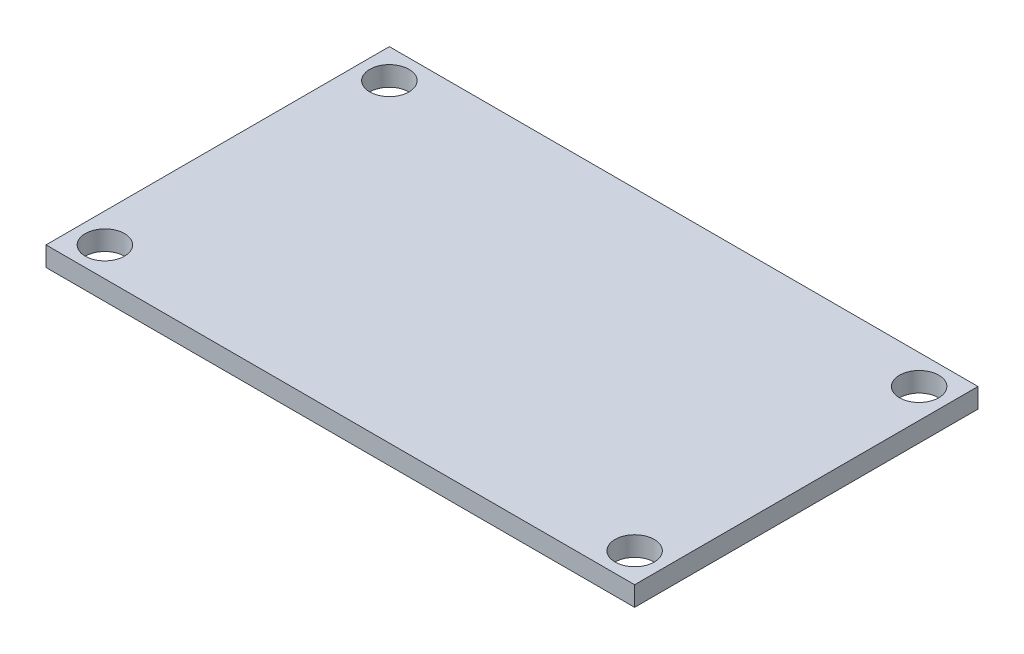
ISO-10303-21;
HEADER;
FILE_DESCRIPTION(('STEP AP214'),'2;1');
FILE_NAME('part.step','',(''),(''),'','','');
FILE_SCHEMA(('AUTOMOTIVE_DESIGN { 1 0 10303 214 1 1 1 1 }'));
ENDSEC;
DATA;
#1=APPLICATION_CONTEXT('core data for automotive mechanical design processes');
#2=APPLICATION_PROTOCOL_DEFINITION('international standard','automotive_design',2000,#1);
#3=PRODUCT_CONTEXT('',#1,'mechanical');
#4=PRODUCT('Part','Part','',(#3));
#5=PRODUCT_RELATED_PRODUCT_CATEGORY('part','',(#4));
#6=PRODUCT_DEFINITION_FORMATION('','',#4);
#7=PRODUCT_DEFINITION_CONTEXT('part definition',#1,'design');
#8=PRODUCT_DEFINITION('design','',#6,#7);
#9=PRODUCT_DEFINITION_SHAPE('','',#8);
#10=(LENGTH_UNIT() NAMED_UNIT(*) SI_UNIT(.MILLI.,.METRE.));
#11=(NAMED_UNIT(*) PLANE_ANGLE_UNIT() SI_UNIT($,.RADIAN.));
#12=(NAMED_UNIT(*) SI_UNIT($,.STERADIAN.) SOLID_ANGLE_UNIT());
#13=UNCERTAINTY_MEASURE_WITH_UNIT(LENGTH_MEASURE(1.E-05),#10,'distance_accuracy_value','');
#14=(GEOMETRIC_REPRESENTATION_CONTEXT(3) GLOBAL_UNCERTAINTY_ASSIGNED_CONTEXT((#13)) GLOBAL_UNIT_ASSIGNED_CONTEXT((#10,
#11,#12)) REPRESENTATION_CONTEXT('',''));
#15=CARTESIAN_POINT('',(0.,0.,0.));
#16=DIRECTION('',(0.,0.,1.));
#17=DIRECTION('',(1.,0.,0.));
#18=AXIS2_PLACEMENT_3D('',#15,#16,#17);
#19=CARTESIAN_POINT('',(0.,-0.399999999999993,-29.5808097472206));
#20=DIRECTION('',(0.,0.,1.));
#21=DIRECTION('',(0.,-1.,0.));
#22=AXIS2_PLACEMENT_3D('',#19,#20,#21);
#23=PLANE('',#22);
#24=DIRECTION('',(1.,0.,0.));
#25=VECTOR('',#24,1.);
#26=CARTESIAN_POINT('',(0.,1.60000000000001,-29.5808097472206));
#27=LINE('',#26,#25);
#28=CARTESIAN_POINT('',(-100.617927731979,1.60000000000001,-29.5808097472206));
#29=VERTEX_POINT('',#28);
#30=CARTESIAN_POINT('',(-40.6179277319788,1.60000000000001,-29.5808097472206));
#31=VERTEX_POINT('',#30);
#32=EDGE_CURVE('E114',#29,#31,#27,.T.);
#33=ORIENTED_EDGE('',*,*,#32,.F.);
#34=DIRECTION('',(0.,1.,0.));
#35=VECTOR('',#34,1.);
#36=CARTESIAN_POINT('',(-100.617927731979,-0.399999999999989,-29.5808097472206));
#37=LINE('',#36,#35);
#38=CARTESIAN_POINT('',(-100.617927731979,-0.399999999999989,-29.5808097472206));
#39=VERTEX_POINT('',#38);
#40=EDGE_CURVE('E11',#39,#29,#37,.T.);
#41=ORIENTED_EDGE('',*,*,#40,.F.);
#42=DIRECTION('',(1.,0.,0.));
#43=VECTOR('',#42,1.);
#44=CARTESIAN_POINT('',(0.,-0.399999999999993,-29.5808097472206));
#45=LINE('',#44,#43);
#46=CARTESIAN_POINT('',(-40.6179277319788,-0.399999999999992,-29.5808097472206));
#47=VERTEX_POINT('',#46);
#48=EDGE_CURVE('E96',#39,#47,#45,.T.);
#49=ORIENTED_EDGE('',*,*,#48,.T.);
#50=DIRECTION('',(0.,1.,0.));
#51=VECTOR('',#50,1.);
#52=CARTESIAN_POINT('',(-40.6179277319788,-0.399999999999992,-29.5808097472206));
#53=LINE('',#52,#51);
#54=EDGE_CURVE('E38',#47,#31,#53,.T.);
#55=ORIENTED_EDGE('',*,*,#54,.T.);
#56=EDGE_LOOP('',(#33,#41,#49,#55));
#57=FACE_BOUND('',#56,.T.);
#58=ADVANCED_FACE('F35',(#57),#23,.T.);
#59=CARTESIAN_POINT('',(-100.617927731979,-0.399999999999994,0.));
#60=DIRECTION('',(1.,0.,0.));
#61=DIRECTION('',(0.,1.,0.));
#62=AXIS2_PLACEMENT_3D('',#59,#60,#61);
#63=PLANE('',#62);
#64=DIRECTION('',(0.,0.,-1.));
#65=VECTOR('',#64,1.);
#66=CARTESIAN_POINT('',(-100.617927731979,1.60000000000001,0.));
#67=LINE('',#66,#65);
#68=CARTESIAN_POINT('',(-100.617927731979,1.60000000000002,-64.5808097472206));
#69=VERTEX_POINT('',#68);
#70=EDGE_CURVE('E68',#29,#69,#67,.T.);
#71=ORIENTED_EDGE('',*,*,#70,.T.);
#72=DIRECTION('',(0.,1.,0.));
#73=VECTOR('',#72,1.);
#74=CARTESIAN_POINT('',(-100.617927731979,-0.399999999999984,-64.5808097472206));
#75=LINE('',#74,#73);
#76=CARTESIAN_POINT('',(-100.617927731979,-0.399999999999984,-64.5808097472206));
#77=VERTEX_POINT('',#76);
#78=EDGE_CURVE('E44',#77,#69,#75,.T.);
#79=ORIENTED_EDGE('',*,*,#78,.F.);
#80=DIRECTION('',(0.,0.,-1.));
#81=VECTOR('',#80,1.);
#82=CARTESIAN_POINT('',(-100.617927731979,-0.399999999999994,0.));
#83=LINE('',#82,#81);
#84=EDGE_CURVE('E86',#39,#77,#83,.T.);
#85=ORIENTED_EDGE('',*,*,#84,.F.);
#86=ORIENTED_EDGE('',*,*,#40,.T.);
#87=EDGE_LOOP('',(#71,#79,#85,#86));
#88=FACE_BOUND('',#87,.T.);
#89=ADVANCED_FACE('F136',(#88),#63,.F.);
#90=CARTESIAN_POINT('',(0.,-0.399999999999988,-64.5808097472206));
#91=DIRECTION('',(0.,0.,1.));
#92=DIRECTION('',(0.,-1.,0.));
#93=AXIS2_PLACEMENT_3D('',#90,#91,#92);
#94=PLANE('',#93);
#95=DIRECTION('',(1.,0.,0.));
#96=VECTOR('',#95,1.);
#97=CARTESIAN_POINT('',(0.,1.60000000000001,-64.5808097472206));
#98=LINE('',#97,#96);
#99=CARTESIAN_POINT('',(-40.6179277319788,1.60000000000001,-64.5808097472206));
#100=VERTEX_POINT('',#99);
#101=EDGE_CURVE('E93',#69,#100,#98,.T.);
#102=ORIENTED_EDGE('',*,*,#101,.T.);
#103=DIRECTION('',(0.,1.,0.));
#104=VECTOR('',#103,1.);
#105=CARTESIAN_POINT('',(-40.6179277319788,-0.399999999999986,-64.5808097472206));
#106=LINE('',#105,#104);
#107=CARTESIAN_POINT('',(-40.6179277319788,-0.399999999999986,-64.5808097472206));
#108=VERTEX_POINT('',#107);
#109=EDGE_CURVE('E90',#108,#100,#106,.T.);
#110=ORIENTED_EDGE('',*,*,#109,.F.);
#111=DIRECTION('',(1.,0.,0.));
#112=VECTOR('',#111,1.);
#113=CARTESIAN_POINT('',(0.,-0.399999999999988,-64.5808097472206));
#114=LINE('',#113,#112);
#115=EDGE_CURVE('E80',#77,#108,#114,.T.);
#116=ORIENTED_EDGE('',*,*,#115,.F.);
#117=ORIENTED_EDGE('',*,*,#78,.T.);
#118=EDGE_LOOP('',(#102,#110,#116,#117));
#119=FACE_BOUND('',#118,.T.);
#120=ADVANCED_FACE('F91',(#119),#94,.F.);
#121=CARTESIAN_POINT('',(-97.6179277319788,-0.399999999999989,-32.5808097472206));
#122=DIRECTION('',(0.,1.,0.));
#123=DIRECTION('',(0.,0.,1.));
#124=AXIS2_PLACEMENT_3D('',#121,#122,#123);
#125=CYLINDRICAL_SURFACE('',#124,2.);
#126=CARTESIAN_POINT('',(-97.6179277319788,-0.399999999999989,-32.5808097472206));
#127=DIRECTION('',(0.,1.,0.));
#128=DIRECTION('',(0.,0.,1.));
#129=AXIS2_PLACEMENT_3D('',#126,#127,#128);
#130=CIRCLE('',#129,2.);
#131=CARTESIAN_POINT('',(-97.6179277319788,-0.399999999999989,-30.5808097472206));
#132=VERTEX_POINT('',#131);
#133=EDGE_CURVE('E108',#132,#132,#130,.T.);
#134=ORIENTED_EDGE('',*,*,#133,.F.);
#135=EDGE_LOOP('',(#134));
#136=FACE_BOUND('',#135,.T.);
#137=CARTESIAN_POINT('',(-97.6179277319788,1.60000000000001,-32.5808097472206));
#138=DIRECTION('',(0.,1.,0.));
#139=DIRECTION('',(0.,0.,1.));
#140=AXIS2_PLACEMENT_3D('',#137,#138,#139);
#141=CIRCLE('',#140,2.);
#142=CARTESIAN_POINT('',(-97.6179277319788,1.60000000000001,-30.5808097472206));
#143=VERTEX_POINT('',#142);
#144=EDGE_CURVE('E127',#143,#143,#141,.T.);
#145=ORIENTED_EDGE('',*,*,#144,.T.);
#146=EDGE_LOOP('',(#145));
#147=FACE_BOUND('',#146,.T.);
#148=ADVANCED_FACE('F144',(#136,#147),#125,.F.);
#149=CARTESIAN_POINT('',(-43.6179277319788,-0.399999999999987,-61.5808097472206));
#150=DIRECTION('',(0.,1.,0.));
#151=DIRECTION('',(0.,0.,1.));
#152=AXIS2_PLACEMENT_3D('',#149,#150,#151);
#153=CYLINDRICAL_SURFACE('',#152,2.);
#154=CARTESIAN_POINT('',(-43.6179277319788,-0.399999999999987,-61.5808097472206));
#155=DIRECTION('',(0.,1.,0.));
#156=DIRECTION('',(0.,0.,1.));
#157=AXIS2_PLACEMENT_3D('',#154,#155,#156);
#158=CIRCLE('',#157,2.);
#159=CARTESIAN_POINT('',(-43.6179277319788,-0.399999999999987,-59.5808097472206));
#160=VERTEX_POINT('',#159);
#161=EDGE_CURVE('E105',#160,#160,#158,.T.);
#162=ORIENTED_EDGE('',*,*,#161,.F.);
#163=EDGE_LOOP('',(#162));
#164=FACE_BOUND('',#163,.T.);
#165=CARTESIAN_POINT('',(-43.6179277319788,1.60000000000001,-61.5808097472206));
#166=DIRECTION('',(0.,1.,0.));
#167=DIRECTION('',(0.,0.,1.));
#168=AXIS2_PLACEMENT_3D('',#165,#166,#167);
#169=CIRCLE('',#168,2.);
#170=CARTESIAN_POINT('',(-43.6179277319788,1.60000000000001,-59.5808097472206));
#171=VERTEX_POINT('',#170);
#172=EDGE_CURVE('E124',#171,#171,#169,.T.);
#173=ORIENTED_EDGE('',*,*,#172,.T.);
#174=EDGE_LOOP('',(#173));
#175=FACE_BOUND('',#174,.T.);
#176=ADVANCED_FACE('F157',(#164,#175),#153,.F.);
#177=CARTESIAN_POINT('',(-43.6179277319788,-0.399999999999991,-32.5808097472206));
#178=DIRECTION('',(0.,1.,0.));
#179=DIRECTION('',(0.,0.,1.));
#180=AXIS2_PLACEMENT_3D('',#177,#178,#179);
#181=CYLINDRICAL_SURFACE('',#180,2.);
#182=CARTESIAN_POINT('',(-43.6179277319788,-0.399999999999991,-32.5808097472206));
#183=DIRECTION('',(0.,1.,0.));
#184=DIRECTION('',(0.,0.,1.));
#185=AXIS2_PLACEMENT_3D('',#182,#183,#184);
#186=CIRCLE('',#185,2.);
#187=CARTESIAN_POINT('',(-43.6179277319788,-0.399999999999992,-30.5808097472207));
#188=VERTEX_POINT('',#187);
#189=EDGE_CURVE('E102',#188,#188,#186,.F.);
#190=ORIENTED_EDGE('',*,*,#189,.T.);
#191=EDGE_LOOP('',(#190));
#192=FACE_BOUND('',#191,.T.);
#193=CARTESIAN_POINT('',(-43.6179277319788,1.60000000000001,-32.5808097472206));
#194=DIRECTION('',(0.,1.,0.));
#195=DIRECTION('',(0.,0.,1.));
#196=AXIS2_PLACEMENT_3D('',#193,#194,#195);
#197=CIRCLE('',#196,2.);
#198=CARTESIAN_POINT('',(-43.6179277319788,1.60000000000001,-30.5808097472207));
#199=VERTEX_POINT('',#198);
#200=EDGE_CURVE('E121',#199,#199,#197,.F.);
#201=ORIENTED_EDGE('',*,*,#200,.F.);
#202=EDGE_LOOP('',(#201));
#203=FACE_BOUND('',#202,.T.);
#204=ADVANCED_FACE('F147',(#192,#203),#181,.F.);
#205=CARTESIAN_POINT('',(-40.6179277319788,-0.399999999999996,0.));
#206=DIRECTION('',(1.,0.,0.));
#207=DIRECTION('',(0.,0.,-1.));
#208=AXIS2_PLACEMENT_3D('',#205,#206,#207);
#209=PLANE('',#208);
#210=DIRECTION('',(0.,0.,-1.));
#211=VECTOR('',#210,1.);
#212=CARTESIAN_POINT('',(-40.6179277319788,1.6,0.));
#213=LINE('',#212,#211);
#214=EDGE_CURVE('E117',#31,#100,#213,.T.);
#215=ORIENTED_EDGE('',*,*,#214,.F.);
#216=ORIENTED_EDGE('',*,*,#54,.F.);
#217=DIRECTION('',(0.,0.,-1.));
#218=VECTOR('',#217,1.);
#219=CARTESIAN_POINT('',(-40.6179277319788,-0.399999999999996,0.));
#220=LINE('',#219,#218);
#221=EDGE_CURVE('E85',#47,#108,#220,.T.);
#222=ORIENTED_EDGE('',*,*,#221,.T.);
#223=ORIENTED_EDGE('',*,*,#109,.T.);
#224=EDGE_LOOP('',(#215,#216,#222,#223));
#225=FACE_BOUND('',#224,.T.);
#226=ADVANCED_FACE('F95',(#225),#209,.T.);
#227=CARTESIAN_POINT('',(-97.6179277319788,-0.399999999999985,-61.5808097472206));
#228=DIRECTION('',(0.,1.,0.));
#229=DIRECTION('',(0.,0.,1.));
#230=AXIS2_PLACEMENT_3D('',#227,#228,#229);
#231=CYLINDRICAL_SURFACE('',#230,2.);
#232=CARTESIAN_POINT('',(-97.6179277319788,-0.399999999999985,-61.5808097472206));
#233=DIRECTION('',(0.,1.,0.));
#234=DIRECTION('',(0.,0.,1.));
#235=AXIS2_PLACEMENT_3D('',#232,#233,#234);
#236=CIRCLE('',#235,2.);
#237=CARTESIAN_POINT('',(-97.6179277319788,-0.399999999999985,-59.5808097472206));
#238=VERTEX_POINT('',#237);
#239=EDGE_CURVE('E111',#238,#238,#236,.F.);
#240=ORIENTED_EDGE('',*,*,#239,.T.);
#241=EDGE_LOOP('',(#240));
#242=FACE_BOUND('',#241,.T.);
#243=CARTESIAN_POINT('',(-97.6179277319788,1.60000000000002,-61.5808097472206));
#244=DIRECTION('',(0.,1.,0.));
#245=DIRECTION('',(0.,0.,1.));
#246=AXIS2_PLACEMENT_3D('',#243,#244,#245);
#247=CIRCLE('',#246,2.);
#248=CARTESIAN_POINT('',(-97.6179277319788,1.60000000000002,-59.5808097472206));
#249=VERTEX_POINT('',#248);
#250=EDGE_CURVE('E98',#249,#249,#247,.F.);
#251=ORIENTED_EDGE('',*,*,#250,.F.);
#252=EDGE_LOOP('',(#251));
#253=FACE_BOUND('',#252,.T.);
#254=ADVANCED_FACE('F150',(#242,#253),#231,.F.);
#255=CARTESIAN_POINT('',(0.,-0.399999999999998,0.));
#256=DIRECTION('',(0.,1.,0.));
#257=DIRECTION('',(0.,0.,1.));
#258=AXIS2_PLACEMENT_3D('',#255,#256,#257);
#259=PLANE('',#258);
#260=ORIENTED_EDGE('',*,*,#48,.F.);
#261=ORIENTED_EDGE('',*,*,#84,.T.);
#262=ORIENTED_EDGE('',*,*,#115,.T.);
#263=ORIENTED_EDGE('',*,*,#221,.F.);
#264=EDGE_LOOP('',(#260,#261,#262,#263));
#265=FACE_BOUND('',#264,.T.);
#266=ORIENTED_EDGE('',*,*,#189,.F.);
#267=EDGE_LOOP('',(#266));
#268=FACE_BOUND('',#267,.T.);
#269=ORIENTED_EDGE('',*,*,#161,.T.);
#270=EDGE_LOOP('',(#269));
#271=FACE_BOUND('',#270,.T.);
#272=ORIENTED_EDGE('',*,*,#133,.T.);
#273=EDGE_LOOP('',(#272));
#274=FACE_BOUND('',#273,.T.);
#275=ORIENTED_EDGE('',*,*,#239,.F.);
#276=EDGE_LOOP('',(#275));
#277=FACE_BOUND('',#276,.T.);
#278=ADVANCED_FACE('F83',(#265,#268,#271,#274,#277),#259,.F.);
#279=CARTESIAN_POINT('',(0.,1.6,0.));
#280=DIRECTION('',(0.,1.,0.));
#281=DIRECTION('',(0.,0.,1.));
#282=AXIS2_PLACEMENT_3D('',#279,#280,#281);
#283=PLANE('',#282);
#284=ORIENTED_EDGE('',*,*,#32,.T.);
#285=ORIENTED_EDGE('',*,*,#214,.T.);
#286=ORIENTED_EDGE('',*,*,#101,.F.);
#287=ORIENTED_EDGE('',*,*,#70,.F.);
#288=EDGE_LOOP('',(#284,#285,#286,#287));
#289=FACE_BOUND('',#288,.T.);
#290=ORIENTED_EDGE('',*,*,#200,.T.);
#291=EDGE_LOOP('',(#290));
#292=FACE_BOUND('',#291,.T.);
#293=ORIENTED_EDGE('',*,*,#172,.F.);
#294=EDGE_LOOP('',(#293));
#295=FACE_BOUND('',#294,.T.);
#296=ORIENTED_EDGE('',*,*,#144,.F.);
#297=EDGE_LOOP('',(#296));
#298=FACE_BOUND('',#297,.T.);
#299=ORIENTED_EDGE('',*,*,#250,.T.);
#300=EDGE_LOOP('',(#299));
#301=FACE_BOUND('',#300,.T.);
#302=ADVANCED_FACE('F133',(#289,#292,#295,#298,#301),#283,.T.);
#303=CLOSED_SHELL('',(#58,#89,#120,#148,#176,#204,#226,#254,#278,#302));
#304=MANIFOLD_SOLID_BREP('B2',#303);
#305=ADVANCED_BREP_SHAPE_REPRESENTATION('',(#18,#304),#14);
#306=SHAPE_DEFINITION_REPRESENTATION(#9,#305);
ENDSEC;
END-ISO-10303-21;
